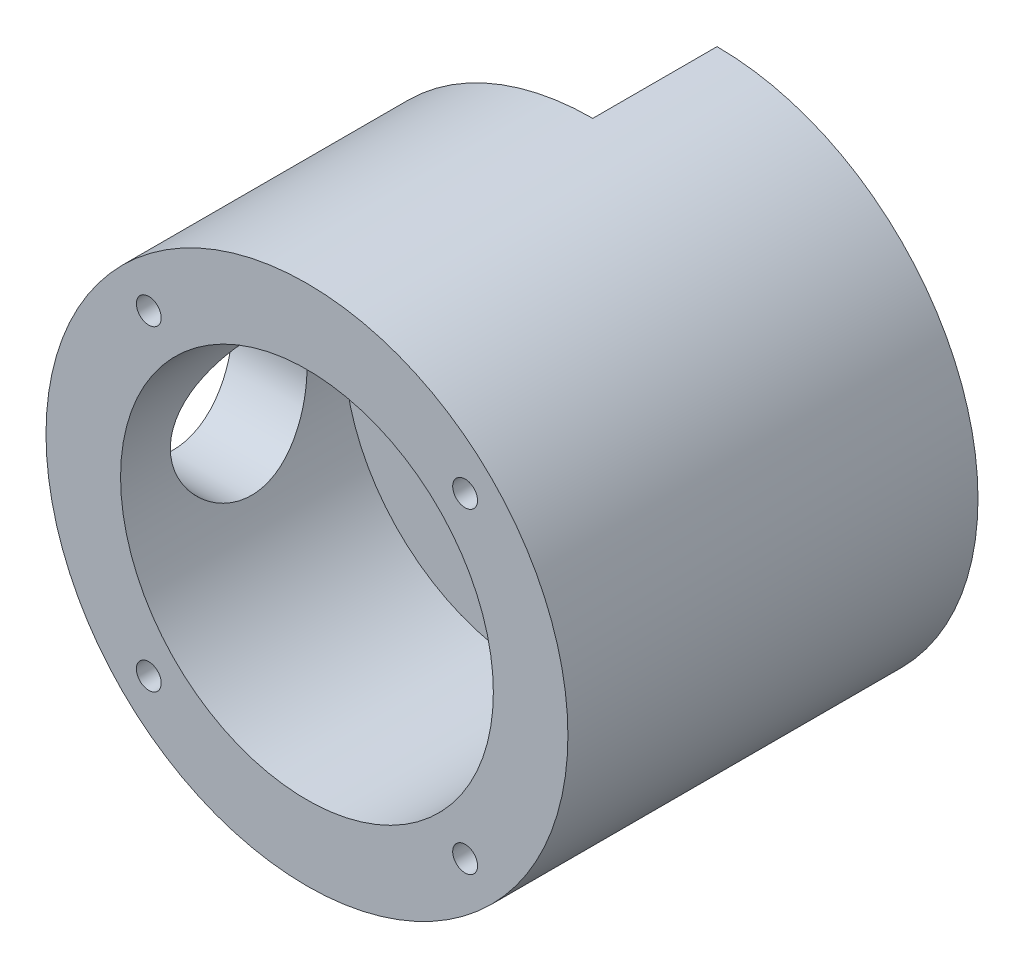
ISO-10303-21;
HEADER;
FILE_DESCRIPTION(('STEP AP214'),'2;1');
FILE_NAME('part.step','',(''),(''),'','','');
FILE_SCHEMA(('AUTOMOTIVE_DESIGN { 1 0 10303 214 1 1 1 1 }'));
ENDSEC;
DATA;
#1=APPLICATION_CONTEXT('core data for automotive mechanical design processes');
#2=APPLICATION_PROTOCOL_DEFINITION('international standard','automotive_design',2000,#1);
#3=PRODUCT_CONTEXT('',#1,'mechanical');
#4=PRODUCT('Part','Part','',(#3));
#5=PRODUCT_RELATED_PRODUCT_CATEGORY('part','',(#4));
#6=PRODUCT_DEFINITION_FORMATION('','',#4);
#7=PRODUCT_DEFINITION_CONTEXT('part definition',#1,'design');
#8=PRODUCT_DEFINITION('design','',#6,#7);
#9=PRODUCT_DEFINITION_SHAPE('','',#8);
#10=(LENGTH_UNIT() NAMED_UNIT(*) SI_UNIT(.MILLI.,.METRE.));
#11=(NAMED_UNIT(*) PLANE_ANGLE_UNIT() SI_UNIT($,.RADIAN.));
#12=(NAMED_UNIT(*) SI_UNIT($,.STERADIAN.) SOLID_ANGLE_UNIT());
#13=UNCERTAINTY_MEASURE_WITH_UNIT(LENGTH_MEASURE(1.E-05),#10,'distance_accuracy_value','');
#14=(GEOMETRIC_REPRESENTATION_CONTEXT(3) GLOBAL_UNCERTAINTY_ASSIGNED_CONTEXT((#13)) GLOBAL_UNIT_ASSIGNED_CONTEXT((#10,
#11,#12)) REPRESENTATION_CONTEXT('',''));
#15=CARTESIAN_POINT('',(0.,0.,0.));
#16=DIRECTION('',(0.,0.,1.));
#17=DIRECTION('',(1.,0.,0.));
#18=AXIS2_PLACEMENT_3D('',#15,#16,#17);
#19=CARTESIAN_POINT('',(0.,0.,16.5));
#20=DIRECTION('',(0.,0.,-1.));
#21=DIRECTION('',(-1.,0.,0.));
#22=AXIS2_PLACEMENT_3D('',#19,#20,#21);
#23=CYLINDRICAL_SURFACE('',#22,10.5);
#24=CARTESIAN_POINT('',(0.,0.,16.5));
#25=DIRECTION('',(0.,0.,1.));
#26=DIRECTION('',(1.,0.,0.));
#27=AXIS2_PLACEMENT_3D('',#24,#25,#26);
#28=CIRCLE('',#27,10.5);
#29=CARTESIAN_POINT('',(10.5,0.,16.5));
#30=VERTEX_POINT('',#29);
#31=EDGE_CURVE('E109',#30,#30,#28,.T.);
#32=ORIENTED_EDGE('',*,*,#31,.F.);
#33=EDGE_LOOP('',(#32));
#34=FACE_BOUND('',#33,.T.);
#35=CARTESIAN_POINT('',(-10.5,0.,9.));
#36=CARTESIAN_POINT('',(-10.4999976211832,0.151699030354285,9.00000380161948));
#37=CARTESIAN_POINT('',(-10.4966800161284,0.303439282198767,9.01259445179598));
#38=CARTESIAN_POINT('',(-10.4837674112809,0.602555081645901,9.06253926101277));
#39=CARTESIAN_POINT('',(-10.4741692343896,0.749928380714927,9.09990595342234));
#40=CARTESIAN_POINT('',(-10.4497558838716,1.03594889526858,9.19810958008399));
#41=CARTESIAN_POINT('',(-10.4349473049954,1.1746068813669,9.25891685509717));
#42=CARTESIAN_POINT('',(-10.4016816762864,1.43975589002758,9.40216722285691));
#43=CARTESIAN_POINT('',(-10.3832244178235,1.5662462162333,9.48461155288927));
#44=CARTESIAN_POINT('',(-10.3441944173703,1.80630697743584,9.67074874961714));
#45=CARTESIAN_POINT('',(-10.3235865293706,1.91956554687952,9.77483647100944));
#46=CARTESIAN_POINT('',(-10.282805840635,2.12723485642639,10.0004613265596));
#47=CARTESIAN_POINT('',(-10.2626330941127,2.22164325997989,10.1220006207003));
#48=CARTESIAN_POINT('',(-10.2246487400459,2.39043716747778,10.3815480933046));
#49=CARTESIAN_POINT('',(-10.2068815571234,2.46446679119027,10.5197948114292));
#50=CARTESIAN_POINT('',(-10.1762355329475,2.5881105434163,10.8073125815189));
#51=CARTESIAN_POINT('',(-10.1633558257529,2.63772899745505,10.9565816749846));
#52=CARTESIAN_POINT('',(-10.1443054302581,2.71006441497166,11.2584601860755));
#53=CARTESIAN_POINT('',(-10.1379943064967,2.73334545671158,11.4109253652931));
#54=CARTESIAN_POINT('',(-10.1323758380217,2.75410333127123,11.7177179296329));
#55=CARTESIAN_POINT('',(-10.1330672345731,2.75158480168089,11.8720449750947));
#56=CARTESIAN_POINT('',(-10.141249834272,2.72126349646028,12.1738011480325));
#57=CARTESIAN_POINT('',(-10.1485582884237,2.69414021293324,12.3213042923172));
#58=CARTESIAN_POINT('',(-10.1688593120466,2.61646635255774,12.6095898013828));
#59=CARTESIAN_POINT('',(-10.1818523214475,2.56591396250477,12.7503716450645));
#60=CARTESIAN_POINT('',(-10.2122212111083,2.44225583822384,13.0230042557005));
#61=CARTESIAN_POINT('',(-10.2296434789058,2.36890945220081,13.1547404850376));
#62=CARTESIAN_POINT('',(-10.2668825360075,2.20191337517857,13.4042754815964));
#63=CARTESIAN_POINT('',(-10.2866997812112,2.10825981587359,13.5220715867516));
#64=CARTESIAN_POINT('',(-10.3272591505417,1.89982032136867,13.7442682166731));
#65=CARTESIAN_POINT('',(-10.3480107723651,1.78446295417953,13.8481316860831));
#66=CARTESIAN_POINT('',(-10.3875415459927,1.53771555615344,14.0351467610954));
#67=CARTESIAN_POINT('',(-10.4063206253941,1.40632493719303,14.1182976065874));
#68=CARTESIAN_POINT('',(-10.4398992665687,1.13042817004538,14.261751984903));
#69=CARTESIAN_POINT('',(-10.4546823361005,0.985870863221988,14.3219612398386));
#70=CARTESIAN_POINT('',(-10.4784839163945,0.688211172875008,14.4170700963469));
#71=CARTESIAN_POINT('',(-10.487503640756,0.535110595713275,14.4519750265118));
#72=CARTESIAN_POINT('',(-10.4985798673941,0.2292960996151,14.4946479031064));
#73=CARTESIAN_POINT('',(-10.5008237661466,0.0766907493557651,14.5031463610687));
#74=CARTESIAN_POINT('',(-10.4986328208253,-0.227763755149755,14.4947784245054));
#75=CARTESIAN_POINT('',(-10.4941986408529,-0.379612983081902,14.4779145521362));
#76=CARTESIAN_POINT('',(-10.4792705379926,-0.675657576422796,14.4199007532301));
#77=CARTESIAN_POINT('',(-10.4688776931323,-0.819937840612927,14.379155677693));
#78=CARTESIAN_POINT('',(-10.4432088014506,-1.09960336766341,14.2750039580943));
#79=CARTESIAN_POINT('',(-10.4279322353376,-1.23498768276126,14.211594904062));
#80=CARTESIAN_POINT('',(-10.3937484592314,-1.49587662833364,14.0625425286576));
#81=CARTESIAN_POINT('',(-10.3747775851939,-1.62114370152729,13.9764983685683));
#82=CARTESIAN_POINT('',(-10.3353993918188,-1.85571833102839,13.7851246097984));
#83=CARTESIAN_POINT('',(-10.314991799635,-1.96502284371534,13.6797913418238));
#84=CARTESIAN_POINT('',(-10.2743550479459,-2.16762826163148,13.4494250193178));
#85=CARTESIAN_POINT('',(-10.2541457480291,-2.26041457148243,13.3239350608389));
#86=CARTESIAN_POINT('',(-10.2168050032952,-2.42361951747844,13.0587415866291));
#87=CARTESIAN_POINT('',(-10.1996734268538,-2.49403911027472,12.9190386791407));
#88=CARTESIAN_POINT('',(-10.170622883033,-2.60998166653511,12.6301008576905));
#89=CARTESIAN_POINT('',(-10.158673498307,-2.65565031429551,12.48092762472));
#90=CARTESIAN_POINT('',(-10.1413264323651,-2.72115196995047,12.1766548571598));
#91=CARTESIAN_POINT('',(-10.1359271486466,-2.74099129715573,12.0215567816832));
#92=CARTESIAN_POINT('',(-10.1324220951806,-2.75391719761804,11.7150958917912));
#93=CARTESIAN_POINT('',(-10.1340912086084,-2.74782946924648,11.5637699469166));
#94=CARTESIAN_POINT('',(-10.1440097395921,-2.71098193388369,11.2643832959387));
#95=CARTESIAN_POINT('',(-10.1522589990313,-2.68022271973234,11.1163225114636));
#96=CARTESIAN_POINT('',(-10.1742767855506,-2.59537614780223,10.8286669905732));
#97=CARTESIAN_POINT('',(-10.1880052532621,-2.54145789608221,10.6890190943468));
#98=CARTESIAN_POINT('',(-10.2194368711659,-2.41195566960282,10.4206474456871));
#99=CARTESIAN_POINT('',(-10.2371406242772,-2.33636840789159,10.291925354421));
#100=CARTESIAN_POINT('',(-10.275157455233,-2.16314628240861,10.0451036669708));
#101=CARTESIAN_POINT('',(-10.2955304541147,-2.06494517636386,9.92741063918568));
#102=CARTESIAN_POINT('',(-10.3362490598169,-1.8503675925024,9.70990558859248));
#103=CARTESIAN_POINT('',(-10.3565946588404,-1.73398673418866,9.6100978878161));
#104=CARTESIAN_POINT('',(-10.3954624251291,-1.48348626520137,9.42919845059151));
#105=CARTESIAN_POINT('',(-10.413938891974,-1.34905304383382,9.34853035968108));
#106=CARTESIAN_POINT('',(-10.4464921374026,-1.06805625594693,9.21106655237914));
#107=CARTESIAN_POINT('',(-10.4605718347814,-0.921500818857354,9.15425499015979));
#108=CARTESIAN_POINT('',(-10.4808477513834,-0.646170211360511,9.07382757314458));
#109=CARTESIAN_POINT('',(-10.4879783940631,-0.518619639204752,9.04620521175427));
#110=CARTESIAN_POINT('',(-10.4975553264723,-0.260722689528127,9.00929062943811));
#111=CARTESIAN_POINT('',(-10.5000020444558,-0.130376568708019,8.99999673272728));
#112=CARTESIAN_POINT('',(-10.5,0.,9.));
#113=B_SPLINE_CURVE_WITH_KNOTS('',3,(#35,#36,#37,#38,#39,#40,#41,#42,#43,#44,#45,#46,#47,#48,
#49,#50,#51,#52,#53,#54,#55,#56,#57,#58,#59,#60,#61,#62,#63,#64,#65,#66,#67,#68,#69,#70,#71,#72,
#73,#74,#75,#76,#77,#78,#79,#80,#81,#82,#83,#84,#85,#86,#87,#88,#89,#90,#91,#92,#93,#94,#95,#96,
#97,#98,#99,#100,#101,#102,#103,#104,#105,#106,#107,#108,#109,#110,#111,#112),.UNSPECIFIED.,.T.,
.F.,(4,2,2,2,2,2,2,2,2,2,2,2,2,2,2,2,2,2,2,2,2,2,2,2,2,2,2,2,2,2,2,2,2,2,2,2,2,2,4),(0.,
0.454619067375411,0.909468286935072,1.3637438673851,1.8180454306337,2.28150550262405,
2.74502298663621,3.21618449651077,3.68726248905687,4.14804800533863,4.60875069478824,
5.05710536682821,5.50549474332855,5.95878884109013,6.4121693626496,6.87979239640732,
7.34743258843057,7.81697432545315,8.28641715749482,8.74275209708794,9.19904165946454,
9.64781089463176,10.0966278638108,10.5540013012772,11.0114618337119,11.4813325478001,
11.9511831622489,12.4182373378545,12.8851772241423,13.3373595740061,13.7895310585453,
14.2384554900225,14.687448054492,15.1492187209845,15.6111008254151,16.0824114838811,
16.5534085943846,16.9441631953516,17.3348820676821),.UNSPECIFIED.);
#114=CARTESIAN_POINT('',(-10.5,0.,9.));
#115=VERTEX_POINT('',#114);
#116=EDGE_CURVE('E125',#115,#115,#113,.T.);
#117=ORIENTED_EDGE('',*,*,#116,.T.);
#118=EDGE_LOOP('',(#117));
#119=FACE_BOUND('',#118,.T.);
#120=DIRECTION('',(0.,0.,1.));
#121=VECTOR('',#120,1.);
#122=CARTESIAN_POINT('',(0.,10.5,0.));
#123=LINE('',#122,#121);
#124=CARTESIAN_POINT('',(0.,10.5,0.));
#125=VERTEX_POINT('',#124);
#126=CARTESIAN_POINT('',(0.,10.5,5.));
#127=VERTEX_POINT('',#126);
#128=EDGE_CURVE('E84',#125,#127,#123,.T.);
#129=ORIENTED_EDGE('',*,*,#128,.T.);
#130=CARTESIAN_POINT('',(0.,0.,5.));
#131=DIRECTION('',(0.,0.,1.));
#132=DIRECTION('',(0.,-1.,0.));
#133=AXIS2_PLACEMENT_3D('',#130,#131,#132);
#134=CIRCLE('',#133,10.5);
#135=CARTESIAN_POINT('',(0.,-10.5,5.));
#136=VERTEX_POINT('',#135);
#137=EDGE_CURVE('E126',#127,#136,#134,.T.);
#138=ORIENTED_EDGE('',*,*,#137,.T.);
#139=DIRECTION('',(0.,0.,-1.));
#140=VECTOR('',#139,1.);
#141=CARTESIAN_POINT('',(0.,-10.5,0.));
#142=LINE('',#141,#140);
#143=CARTESIAN_POINT('',(0.,-10.5,0.));
#144=VERTEX_POINT('',#143);
#145=EDGE_CURVE('E108',#136,#144,#142,.T.);
#146=ORIENTED_EDGE('',*,*,#145,.T.);
#147=CARTESIAN_POINT('',(0.,0.,0.));
#148=DIRECTION('',(0.,0.,1.));
#149=DIRECTION('',(1.,0.,0.));
#150=AXIS2_PLACEMENT_3D('',#147,#148,#149);
#151=CIRCLE('',#150,10.5);
#152=EDGE_CURVE('E101',#144,#125,#151,.T.);
#153=ORIENTED_EDGE('',*,*,#152,.T.);
#154=EDGE_LOOP('',(#129,#138,#146,#153));
#155=FACE_BOUND('',#154,.T.);
#156=ADVANCED_FACE('F33',(#34,#119,#155),#23,.T.);
#157=CARTESIAN_POINT('',(0.,0.,0.));
#158=DIRECTION('',(0.,0.,1.));
#159=DIRECTION('',(1.,0.,0.));
#160=AXIS2_PLACEMENT_3D('',#157,#158,#159);
#161=PLANE('',#160);
#162=DIRECTION('',(0.,1.,0.));
#163=VECTOR('',#162,1.);
#164=CARTESIAN_POINT('',(0.,10.5,0.));
#165=LINE('',#164,#163);
#166=CARTESIAN_POINT('',(0.,5.5,0.));
#167=VERTEX_POINT('',#166);
#168=EDGE_CURVE('E87',#167,#125,#165,.T.);
#169=ORIENTED_EDGE('',*,*,#168,.T.);
#170=ORIENTED_EDGE('',*,*,#152,.F.);
#171=CARTESIAN_POINT('',(0.,-5.5,0.));
#172=VERTEX_POINT('',#171);
#173=EDGE_CURVE('E94',#144,#172,#165,.T.);
#174=ORIENTED_EDGE('',*,*,#173,.T.);
#175=CARTESIAN_POINT('',(0.,0.,0.));
#176=DIRECTION('',(0.,0.,-1.));
#177=DIRECTION('',(-1.,0.,0.));
#178=AXIS2_PLACEMENT_3D('',#175,#176,#177);
#179=CIRCLE('',#178,5.5);
#180=EDGE_CURVE('E103',#167,#172,#179,.T.);
#181=ORIENTED_EDGE('',*,*,#180,.F.);
#182=EDGE_LOOP('',(#169,#170,#174,#181));
#183=FACE_BOUND('',#182,.T.);
#184=ADVANCED_FACE('F99',(#183),#161,.F.);
#185=CARTESIAN_POINT('',(0.,0.,0.));
#186=DIRECTION('',(0.,0.,-1.));
#187=DIRECTION('',(-1.,0.,0.));
#188=AXIS2_PLACEMENT_3D('',#185,#186,#187);
#189=CYLINDRICAL_SURFACE('',#188,7.5);
#190=DIRECTION('',(0.,0.,-1.));
#191=VECTOR('',#190,1.);
#192=CARTESIAN_POINT('',(0.,7.5,0.));
#193=LINE('',#192,#191);
#194=CARTESIAN_POINT('',(0.,7.5,2.5));
#195=VERTEX_POINT('',#194);
#196=CARTESIAN_POINT('',(0.,7.5,5.));
#197=VERTEX_POINT('',#196);
#198=EDGE_CURVE('E431',#195,#197,#193,.F.);
#199=ORIENTED_EDGE('',*,*,#198,.F.);
#200=CARTESIAN_POINT('',(0.,0.,2.5));
#201=DIRECTION('',(0.,0.,-1.));
#202=DIRECTION('',(-1.,0.,0.));
#203=AXIS2_PLACEMENT_3D('',#200,#201,#202);
#204=CIRCLE('',#203,7.5);
#205=CARTESIAN_POINT('',(0.,-7.5,2.5));
#206=VERTEX_POINT('',#205);
#207=EDGE_CURVE('E153',#195,#206,#204,.T.);
#208=ORIENTED_EDGE('',*,*,#207,.T.);
#209=DIRECTION('',(0.,0.,-1.));
#210=VECTOR('',#209,1.);
#211=CARTESIAN_POINT('',(0.,-7.5,0.));
#212=LINE('',#211,#210);
#213=CARTESIAN_POINT('',(0.,-7.5,5.));
#214=VERTEX_POINT('',#213);
#215=EDGE_CURVE('E430',#214,#206,#212,.T.);
#216=ORIENTED_EDGE('',*,*,#215,.F.);
#217=CARTESIAN_POINT('',(0.,0.,5.));
#218=DIRECTION('',(0.,0.,-1.));
#219=DIRECTION('',(-1.,0.,0.));
#220=AXIS2_PLACEMENT_3D('',#217,#218,#219);
#221=CIRCLE('',#220,7.5);
#222=EDGE_CURVE('E156',#197,#214,#221,.T.);
#223=ORIENTED_EDGE('',*,*,#222,.F.);
#224=EDGE_LOOP('',(#199,#208,#216,#223));
#225=FACE_BOUND('',#224,.T.);
#226=ADVANCED_FACE('F199',(#225),#189,.F.);
#227=CARTESIAN_POINT('',(0.,7.5,2.5));
#228=DIRECTION('',(0.,0.,-1.));
#229=DIRECTION('',(-1.,0.,0.));
#230=AXIS2_PLACEMENT_3D('',#227,#228,#229);
#231=PLANE('',#230);
#232=DIRECTION('',(0.,1.,0.));
#233=VECTOR('',#232,1.);
#234=CARTESIAN_POINT('',(0.,7.5,2.5));
#235=LINE('',#234,#233);
#236=CARTESIAN_POINT('',(0.,-5.5,2.5));
#237=VERTEX_POINT('',#236);
#238=EDGE_CURVE('E48',#206,#237,#235,.T.);
#239=ORIENTED_EDGE('',*,*,#238,.F.);
#240=ORIENTED_EDGE('',*,*,#207,.F.);
#241=CARTESIAN_POINT('',(0.,5.5,2.5));
#242=VERTEX_POINT('',#241);
#243=EDGE_CURVE('E55',#242,#195,#235,.T.);
#244=ORIENTED_EDGE('',*,*,#243,.F.);
#245=CARTESIAN_POINT('',(0.,0.,2.5));
#246=DIRECTION('',(0.,0.,-1.));
#247=DIRECTION('',(-1.,0.,0.));
#248=AXIS2_PLACEMENT_3D('',#245,#246,#247);
#249=CIRCLE('',#248,5.5);
#250=EDGE_CURVE('E150',#242,#237,#249,.T.);
#251=ORIENTED_EDGE('',*,*,#250,.T.);
#252=EDGE_LOOP('',(#239,#240,#244,#251));
#253=FACE_BOUND('',#252,.T.);
#254=ADVANCED_FACE('F203',(#253),#231,.F.);
#255=CARTESIAN_POINT('',(0.,0.,0.));
#256=DIRECTION('',(0.,0.,-1.));
#257=DIRECTION('',(-1.,0.,0.));
#258=AXIS2_PLACEMENT_3D('',#255,#256,#257);
#259=CYLINDRICAL_SURFACE('',#258,5.5);
#260=DIRECTION('',(0.,0.,-1.));
#261=VECTOR('',#260,1.);
#262=CARTESIAN_POINT('',(0.,5.5,0.));
#263=LINE('',#262,#261);
#264=EDGE_CURVE('E11',#167,#242,#263,.F.);
#265=ORIENTED_EDGE('',*,*,#264,.F.);
#266=ORIENTED_EDGE('',*,*,#180,.T.);
#267=DIRECTION('',(0.,0.,-1.));
#268=VECTOR('',#267,1.);
#269=CARTESIAN_POINT('',(0.,-5.5,0.));
#270=LINE('',#269,#268);
#271=EDGE_CURVE('E41',#237,#172,#270,.T.);
#272=ORIENTED_EDGE('',*,*,#271,.F.);
#273=ORIENTED_EDGE('',*,*,#250,.F.);
#274=EDGE_LOOP('',(#265,#266,#272,#273));
#275=FACE_BOUND('',#274,.T.);
#276=ADVANCED_FACE('F139',(#275),#259,.F.);
#277=CARTESIAN_POINT('',(0.,0.,16.5));
#278=DIRECTION('',(0.,0.,1.));
#279=DIRECTION('',(1.,0.,0.));
#280=AXIS2_PLACEMENT_3D('',#277,#278,#279);
#281=PLANE('',#280);
#282=CARTESIAN_POINT('',(6.36396103067892,-6.36396103067894,16.5));
#283=DIRECTION('',(0.,0.,1.));
#284=DIRECTION('',(0.,-1.,0.));
#285=AXIS2_PLACEMENT_3D('',#282,#283,#284);
#286=CIRCLE('',#285,0.5);
#287=CARTESIAN_POINT('',(6.36396103067891,-6.86396103067894,16.5));
#288=VERTEX_POINT('',#287);
#289=EDGE_CURVE('E164',#288,#288,#286,.T.);
#290=ORIENTED_EDGE('',*,*,#289,.F.);
#291=EDGE_LOOP('',(#290));
#292=FACE_BOUND('',#291,.T.);
#293=CARTESIAN_POINT('',(-6.36396103067891,-6.36396103067894,16.5));
#294=DIRECTION('',(0.,0.,1.));
#295=DIRECTION('',(-1.,0.,0.));
#296=AXIS2_PLACEMENT_3D('',#293,#294,#295);
#297=CIRCLE('',#296,0.5);
#298=CARTESIAN_POINT('',(-6.86396103067891,-6.36396103067894,16.5));
#299=VERTEX_POINT('',#298);
#300=EDGE_CURVE('E170',#299,#299,#297,.T.);
#301=ORIENTED_EDGE('',*,*,#300,.F.);
#302=EDGE_LOOP('',(#301));
#303=FACE_BOUND('',#302,.T.);
#304=CARTESIAN_POINT('',(-6.36396103067887,6.36396103067898,16.5));
#305=DIRECTION('',(0.,0.,1.));
#306=DIRECTION('',(0.,1.,0.));
#307=AXIS2_PLACEMENT_3D('',#304,#305,#306);
#308=CIRCLE('',#307,0.5);
#309=CARTESIAN_POINT('',(-6.36396103067887,6.86396103067898,16.5));
#310=VERTEX_POINT('',#309);
#311=EDGE_CURVE('E159',#310,#310,#308,.T.);
#312=ORIENTED_EDGE('',*,*,#311,.F.);
#313=EDGE_LOOP('',(#312));
#314=FACE_BOUND('',#313,.T.);
#315=CARTESIAN_POINT('',(6.36396103067891,6.36396103067894,16.5));
#316=DIRECTION('',(0.,0.,1.));
#317=DIRECTION('',(1.,0.,0.));
#318=AXIS2_PLACEMENT_3D('',#315,#316,#317);
#319=CIRCLE('',#318,0.5);
#320=CARTESIAN_POINT('',(6.86396103067891,6.36396103067894,16.5));
#321=VERTEX_POINT('',#320);
#322=EDGE_CURVE('E163',#321,#321,#319,.T.);
#323=ORIENTED_EDGE('',*,*,#322,.F.);
#324=EDGE_LOOP('',(#323));
#325=FACE_BOUND('',#324,.T.);
#326=CARTESIAN_POINT('',(0.,0.,16.5));
#327=DIRECTION('',(0.,0.,1.));
#328=DIRECTION('',(1.,0.,0.));
#329=AXIS2_PLACEMENT_3D('',#326,#327,#328);
#330=CIRCLE('',#329,7.5);
#331=CARTESIAN_POINT('',(7.5,0.,16.5));
#332=VERTEX_POINT('',#331);
#333=EDGE_CURVE('E115',#332,#332,#330,.T.);
#334=ORIENTED_EDGE('',*,*,#333,.F.);
#335=EDGE_LOOP('',(#334));
#336=FACE_BOUND('',#335,.T.);
#337=ORIENTED_EDGE('',*,*,#31,.T.);
#338=EDGE_LOOP('',(#337));
#339=FACE_BOUND('',#338,.T.);
#340=ADVANCED_FACE('F186',(#292,#303,#314,#325,#336,#339),#281,.T.);
#341=CARTESIAN_POINT('',(0.,0.,7.5));
#342=DIRECTION('',(0.,0.,1.));
#343=DIRECTION('',(1.,0.,0.));
#344=AXIS2_PLACEMENT_3D('',#341,#342,#343);
#345=CYLINDRICAL_SURFACE('',#344,7.5);
#346=CARTESIAN_POINT('',(-7.5,0.,9.));
#347=CARTESIAN_POINT('',(-7.50000312186943,-0.149163400914619,8.99999576015585));
#348=CARTESIAN_POINT('',(-7.49551083407196,-0.29829715261848,9.01217451428514));
#349=CARTESIAN_POINT('',(-7.47803771691331,-0.592120610638628,9.06038076394274));
#350=CARTESIAN_POINT('',(-7.46505769251259,-0.736810737017477,9.09640599792119));
#351=CARTESIAN_POINT('',(-7.43200599882739,-1.01746784637523,9.19086854595593));
#352=CARTESIAN_POINT('',(-7.41194764249896,-1.15345064275875,9.2492638038986));
#353=CARTESIAN_POINT('',(-7.36674725461798,-1.41368339201445,9.38659980262048));
#354=CARTESIAN_POINT('',(-7.34160392586796,-1.53793033913379,9.46554578745375));
#355=CARTESIAN_POINT('',(-7.28769120419502,-1.7762429222357,9.64511658714314));
#356=CARTESIAN_POINT('',(-7.25882233991119,-1.88976472910907,9.74643300699934));
#357=CARTESIAN_POINT('',(-7.20121334184221,-2.09863947514447,9.96640025404347));
#358=CARTESIAN_POINT('',(-7.17247324728629,-2.19398720232952,10.085056036644));
#359=CARTESIAN_POINT('',(-7.11723192199313,-2.36719005872892,10.3415596285549));
#360=CARTESIAN_POINT('',(-7.09084889561058,-2.44428985961203,10.4799454567554));
#361=CARTESIAN_POINT('',(-7.04484932142569,-2.5738807153727,10.7688406266334));
#362=CARTESIAN_POINT('',(-7.02523020673632,-2.626381108384,10.9193453424172));
#363=CARTESIAN_POINT('',(-6.99603990329749,-2.70315787768425,11.2219588814006));
#364=CARTESIAN_POINT('',(-6.98610194555094,-2.72846856766621,11.3737687440343));
#365=CARTESIAN_POINT('',(-6.97632326042149,-2.75338169967862,11.6797811892959));
#366=CARTESIAN_POINT('',(-6.97647859485257,-2.7529941686023,11.8339828152304));
#367=CARTESIAN_POINT('',(-6.98655161563675,-2.72731524634158,12.1310789225906));
#368=CARTESIAN_POINT('',(-6.99591416236741,-2.70343999386611,12.2741180714193));
#369=CARTESIAN_POINT('',(-7.02242705549906,-2.63379801380004,12.5539973045031));
#370=CARTESIAN_POINT('',(-7.03957852258203,-2.58802813592603,12.6908364935814));
#371=CARTESIAN_POINT('',(-7.08008337610026,-2.47508832183277,12.9573857915592));
#372=CARTESIAN_POINT('',(-7.10354498086313,-2.40754043957437,13.0869185940038));
#373=CARTESIAN_POINT('',(-7.15398860670264,-2.25322516181072,13.3332293506763));
#374=CARTESIAN_POINT('',(-7.18097180350954,-2.16645134069005,13.4500030210703));
#375=CARTESIAN_POINT('',(-7.23752687525343,-1.96960155284458,13.6753454837079));
#376=CARTESIAN_POINT('',(-7.26715387777086,-1.85838932735392,13.782910199767));
#377=CARTESIAN_POINT('',(-7.32416772152515,-1.61915779399269,13.9781537541427));
#378=CARTESIAN_POINT('',(-7.3515542477326,-1.49113612914646,14.0658297990106));
#379=CARTESIAN_POINT('',(-7.40150404263883,-1.21944943250202,14.219849921192));
#380=CARTESIAN_POINT('',(-7.42399328235867,-1.07558804380358,14.2858733353786));
#381=CARTESIAN_POINT('',(-7.46106828194135,-0.777771681936057,14.3924524315738));
#382=CARTESIAN_POINT('',(-7.47565739110895,-0.623821017253827,14.4330189073552));
#383=CARTESIAN_POINT('',(-7.49470661210037,-0.318657156904126,14.4856341007007));
#384=CARTESIAN_POINT('',(-7.49964681722227,-0.167706972782518,14.4990358318725));
#385=CARTESIAN_POINT('',(-7.50031608885126,0.134347967443713,14.5008630018728));
#386=CARTESIAN_POINT('',(-7.49604709187873,0.28545268437452,14.4892936916369));
#387=CARTESIAN_POINT('',(-7.47909471176213,0.577771015399045,14.4425452079771));
#388=CARTESIAN_POINT('',(-7.46672323625137,0.719144462031497,14.4082406720003));
#389=CARTESIAN_POINT('',(-7.43512235809386,0.994039091678321,14.3181349472647));
#390=CARTESIAN_POINT('',(-7.41589206317618,1.12755925041647,14.2623309615443));
#391=CARTESIAN_POINT('',(-7.3717934654489,1.38727106994184,14.1290539116285));
#392=CARTESIAN_POINT('',(-7.34677844528394,1.51313995048619,14.051001869951));
#393=CARTESIAN_POINT('',(-7.29389308718916,1.75040675458894,13.8761036082178));
#394=CARTESIAN_POINT('',(-7.26602173076095,1.86179948397539,13.7792506731475));
#395=CARTESIAN_POINT('',(-7.20858443222809,2.07340222713799,13.563177374235));
#396=CARTESIAN_POINT('',(-7.17901017230758,2.17265048905075,13.4430149402375));
#397=CARTESIAN_POINT('',(-7.12301420495134,2.34974917445373,13.1871450050785));
#398=CARTESIAN_POINT('',(-7.09659271654603,2.42759811177191,13.0514364251721));
#399=CARTESIAN_POINT('',(-7.05004267507774,2.55965637109161,12.7674626284658));
#400=CARTESIAN_POINT('',(-7.02993081583834,2.61380312956744,12.6191653988561));
#401=CARTESIAN_POINT('',(-6.99881623412452,2.69602324831299,12.314621151899));
#402=CARTESIAN_POINT('',(-6.98780821140261,2.72411178082589,12.1583788165147));
#403=CARTESIAN_POINT('',(-6.97683139543633,2.75209516962454,11.8527486399612));
#404=CARTESIAN_POINT('',(-6.97622414135252,2.75362072167425,11.7035317080346));
#405=CARTESIAN_POINT('',(-6.98449276936025,2.73257863119115,11.4070884497829));
#406=CARTESIAN_POINT('',(-6.99336783146823,2.710013071938,11.2598619524497));
#407=CARTESIAN_POINT('',(-7.01908063198066,2.64267697104267,10.975730914034));
#408=CARTESIAN_POINT('',(-7.03568945153917,2.59854310235921,10.8386530299248));
#409=CARTESIAN_POINT('',(-7.0748745278557,2.48987356543402,10.5737608470382));
#410=CARTESIAN_POINT('',(-7.09745226019147,2.42533285163216,10.445948848854));
#411=CARTESIAN_POINT('',(-7.14745651289183,2.2738785374216,10.196173516875));
#412=CARTESIAN_POINT('',(-7.17507087475862,2.18599626211841,10.0748355716804));
#413=CARTESIAN_POINT('',(-7.23136315938062,1.99188099952364,9.84810675551708));
#414=CARTESIAN_POINT('',(-7.26004141030264,1.88564231243218,9.7427208569003));
#415=CARTESIAN_POINT('',(-7.31698041886031,1.65137159946744,9.54544002029642));
#416=CARTESIAN_POINT('',(-7.34514593066589,1.52250654028015,9.45450259631471));
#417=CARTESIAN_POINT('',(-7.39633669940812,1.25034215145006,9.2956226545033));
#418=CARTESIAN_POINT('',(-7.41936193536523,1.10704276289836,9.22768023052494));
#419=CARTESIAN_POINT('',(-7.45811714803401,0.806234015924115,9.11583002337379));
#420=CARTESIAN_POINT('',(-7.4736521370045,0.648460466045057,9.07255977437051));
#421=CARTESIAN_POINT('',(-7.49458959004745,0.32711098218088,9.01465347812442));
#422=CARTESIAN_POINT('',(-7.4999965772887,0.163537671643998,9.0000046484207));
#423=CARTESIAN_POINT('',(-7.5,0.,9.));
#424=B_SPLINE_CURVE_WITH_KNOTS('',3,(#346,#347,#348,#349,#350,#351,#352,#353,#354,#355,#356,
#357,#358,#359,#360,#361,#362,#363,#364,#365,#366,#367,#368,#369,#370,#371,#372,#373,#374,#375,
#376,#377,#378,#379,#380,#381,#382,#383,#384,#385,#386,#387,#388,#389,#390,#391,#392,#393,#394,
#395,#396,#397,#398,#399,#400,#401,#402,#403,#404,#405,#406,#407,#408,#409,#410,#411,#412,#413,
#414,#415,#416,#417,#418,#419,#420,#421,#422,#423),.UNSPECIFIED.,.T.,.F.,(4,2,2,2,2,2,2,2,2,2,2,
2,2,2,2,2,2,2,2,2,2,2,2,2,2,2,2,2,2,2,2,2,2,2,2,2,2,2,4),(0.,0.446887269349348,
0.893732162923371,1.33974106914939,1.7858638979375,2.24842473965862,2.71111803601497,
3.19050672893151,3.6697132943022,4.12996375453753,4.5900346359978,5.0239670519462,
5.45796192255757,5.89993527296308,6.34205656133036,6.81248619551747,7.28298186270095,
7.76015995462979,8.23713558552159,8.68970480563612,9.14217886831116,9.57818454876607,
10.0142469703521,10.462896209775,10.9117059866708,11.385386450699,11.8590998032843,
12.3340561236824,12.80873572978,13.254164536792,13.6995548284528,14.13252653843,
14.5656053837986,15.020648736522,15.4758336382825,15.9541458857872,16.4324600854427,
16.9226310274791,17.4125830067758),.UNSPECIFIED.);
#425=CARTESIAN_POINT('',(-7.5,0.,9.));
#426=VERTEX_POINT('',#425);
#427=EDGE_CURVE('E119',#426,#426,#424,.T.);
#428=ORIENTED_EDGE('',*,*,#427,.T.);
#429=EDGE_LOOP('',(#428));
#430=FACE_BOUND('',#429,.T.);
#431=CARTESIAN_POINT('',(0.,0.,7.5));
#432=DIRECTION('',(0.,0.,1.));
#433=DIRECTION('',(1.,0.,0.));
#434=AXIS2_PLACEMENT_3D('',#431,#432,#433);
#435=CIRCLE('',#434,7.5);
#436=CARTESIAN_POINT('',(7.5,0.,7.5));
#437=VERTEX_POINT('',#436);
#438=EDGE_CURVE('E110',#437,#437,#435,.T.);
#439=ORIENTED_EDGE('',*,*,#438,.F.);
#440=EDGE_LOOP('',(#439));
#441=FACE_BOUND('',#440,.T.);
#442=ORIENTED_EDGE('',*,*,#333,.T.);
#443=EDGE_LOOP('',(#442));
#444=FACE_BOUND('',#443,.T.);
#445=ADVANCED_FACE('F127',(#430,#441,#444),#345,.F.);
#446=CARTESIAN_POINT('',(0.,0.,7.5));
#447=DIRECTION('',(0.,0.,1.));
#448=DIRECTION('',(1.,0.,0.));
#449=AXIS2_PLACEMENT_3D('',#446,#447,#448);
#450=PLANE('',#449);
#451=ORIENTED_EDGE('',*,*,#438,.T.);
#452=EDGE_LOOP('',(#451));
#453=FACE_BOUND('',#452,.T.);
#454=ADVANCED_FACE('F244',(#453),#450,.T.);
#455=CARTESIAN_POINT('',(6.36396103067891,6.36396103067894,13.5));
#456=DIRECTION('',(0.,0.,1.));
#457=DIRECTION('',(1.,0.,0.));
#458=AXIS2_PLACEMENT_3D('',#455,#456,#457);
#459=CYLINDRICAL_SURFACE('',#458,0.5);
#460=CARTESIAN_POINT('',(6.36396103067891,6.36396103067894,13.5));
#461=DIRECTION('',(0.,0.,1.));
#462=DIRECTION('',(1.,0.,0.));
#463=AXIS2_PLACEMENT_3D('',#460,#461,#462);
#464=CIRCLE('',#463,0.5);
#465=CARTESIAN_POINT('',(6.86396103067891,6.36396103067894,13.5));
#466=VERTEX_POINT('',#465);
#467=EDGE_CURVE('E178',#466,#466,#464,.T.);
#468=ORIENTED_EDGE('',*,*,#467,.F.);
#469=EDGE_LOOP('',(#468));
#470=FACE_BOUND('',#469,.T.);
#471=ORIENTED_EDGE('',*,*,#322,.T.);
#472=EDGE_LOOP('',(#471));
#473=FACE_BOUND('',#472,.T.);
#474=ADVANCED_FACE('F241',(#470,#473),#459,.F.);
#475=CARTESIAN_POINT('',(6.36396103067891,6.36396103067894,13.5));
#476=DIRECTION('',(0.,0.,1.));
#477=DIRECTION('',(1.,0.,0.));
#478=AXIS2_PLACEMENT_3D('',#475,#476,#477);
#479=PLANE('',#478);
#480=ORIENTED_EDGE('',*,*,#467,.T.);
#481=EDGE_LOOP('',(#480));
#482=FACE_BOUND('',#481,.T.);
#483=ADVANCED_FACE('F237',(#482),#479,.T.);
#484=CARTESIAN_POINT('',(-6.36396103067887,6.36396103067898,13.5));
#485=DIRECTION('',(0.,0.,1.));
#486=DIRECTION('',(1.,0.,0.));
#487=AXIS2_PLACEMENT_3D('',#484,#485,#486);
#488=CYLINDRICAL_SURFACE('',#487,0.5);
#489=CARTESIAN_POINT('',(-6.36396103067887,6.36396103067898,13.5));
#490=DIRECTION('',(0.,0.,1.));
#491=DIRECTION('',(0.,1.,0.));
#492=AXIS2_PLACEMENT_3D('',#489,#490,#491);
#493=CIRCLE('',#492,0.5);
#494=CARTESIAN_POINT('',(-6.36396103067887,6.86396103067898,13.5));
#495=VERTEX_POINT('',#494);
#496=EDGE_CURVE('E173',#495,#495,#493,.T.);
#497=ORIENTED_EDGE('',*,*,#496,.F.);
#498=EDGE_LOOP('',(#497));
#499=FACE_BOUND('',#498,.T.);
#500=ORIENTED_EDGE('',*,*,#311,.T.);
#501=EDGE_LOOP('',(#500));
#502=FACE_BOUND('',#501,.T.);
#503=ADVANCED_FACE('F233',(#499,#502),#488,.F.);
#504=CARTESIAN_POINT('',(-6.36396103067887,6.36396103067898,13.5));
#505=DIRECTION('',(0.,0.,1.));
#506=DIRECTION('',(0.,1.,0.));
#507=AXIS2_PLACEMENT_3D('',#504,#505,#506);
#508=PLANE('',#507);
#509=ORIENTED_EDGE('',*,*,#496,.T.);
#510=EDGE_LOOP('',(#509));
#511=FACE_BOUND('',#510,.T.);
#512=ADVANCED_FACE('F229',(#511),#508,.T.);
#513=CARTESIAN_POINT('',(-6.36396103067891,-6.36396103067894,13.5));
#514=DIRECTION('',(0.,0.,1.));
#515=DIRECTION('',(1.,0.,0.));
#516=AXIS2_PLACEMENT_3D('',#513,#514,#515);
#517=CYLINDRICAL_SURFACE('',#516,0.5);
#518=CARTESIAN_POINT('',(-6.36396103067891,-6.36396103067894,13.5));
#519=DIRECTION('',(0.,0.,1.));
#520=DIRECTION('',(-1.,0.,0.));
#521=AXIS2_PLACEMENT_3D('',#518,#519,#520);
#522=CIRCLE('',#521,0.5);
#523=CARTESIAN_POINT('',(-6.86396103067891,-6.36396103067894,13.5));
#524=VERTEX_POINT('',#523);
#525=EDGE_CURVE('E167',#524,#524,#522,.T.);
#526=ORIENTED_EDGE('',*,*,#525,.F.);
#527=EDGE_LOOP('',(#526));
#528=FACE_BOUND('',#527,.T.);
#529=ORIENTED_EDGE('',*,*,#300,.T.);
#530=EDGE_LOOP('',(#529));
#531=FACE_BOUND('',#530,.T.);
#532=ADVANCED_FACE('F225',(#528,#531),#517,.F.);
#533=CARTESIAN_POINT('',(-6.36396103067891,-6.36396103067894,13.5));
#534=DIRECTION('',(0.,0.,1.));
#535=DIRECTION('',(-1.,0.,0.));
#536=AXIS2_PLACEMENT_3D('',#533,#534,#535);
#537=PLANE('',#536);
#538=ORIENTED_EDGE('',*,*,#525,.T.);
#539=EDGE_LOOP('',(#538));
#540=FACE_BOUND('',#539,.T.);
#541=ADVANCED_FACE('F221',(#540),#537,.T.);
#542=CARTESIAN_POINT('',(6.36396103067892,-6.36396103067894,13.5));
#543=DIRECTION('',(0.,0.,1.));
#544=DIRECTION('',(1.,0.,0.));
#545=AXIS2_PLACEMENT_3D('',#542,#543,#544);
#546=CYLINDRICAL_SURFACE('',#545,0.5);
#547=CARTESIAN_POINT('',(6.36396103067892,-6.36396103067894,13.5));
#548=DIRECTION('',(0.,0.,1.));
#549=DIRECTION('',(0.,-1.,0.));
#550=AXIS2_PLACEMENT_3D('',#547,#548,#549);
#551=CIRCLE('',#550,0.5);
#552=CARTESIAN_POINT('',(6.36396103067891,-6.86396103067894,13.5));
#553=VERTEX_POINT('',#552);
#554=EDGE_CURVE('E160',#553,#553,#551,.T.);
#555=ORIENTED_EDGE('',*,*,#554,.F.);
#556=EDGE_LOOP('',(#555));
#557=FACE_BOUND('',#556,.T.);
#558=ORIENTED_EDGE('',*,*,#289,.T.);
#559=EDGE_LOOP('',(#558));
#560=FACE_BOUND('',#559,.T.);
#561=ADVANCED_FACE('F217',(#557,#560),#546,.F.);
#562=CARTESIAN_POINT('',(6.36396103067892,-6.36396103067894,13.5));
#563=DIRECTION('',(0.,0.,1.));
#564=DIRECTION('',(0.,-1.,0.));
#565=AXIS2_PLACEMENT_3D('',#562,#563,#564);
#566=PLANE('',#565);
#567=ORIENTED_EDGE('',*,*,#554,.T.);
#568=EDGE_LOOP('',(#567));
#569=FACE_BOUND('',#568,.T.);
#570=ADVANCED_FACE('F213',(#569),#566,.T.);
#571=CARTESIAN_POINT('',(0.,0.,5.));
#572=DIRECTION('',(0.,0.,1.));
#573=DIRECTION('',(1.,0.,0.));
#574=AXIS2_PLACEMENT_3D('',#571,#572,#573);
#575=PLANE('',#574);
#576=DIRECTION('',(0.,-1.,0.));
#577=VECTOR('',#576,1.);
#578=CARTESIAN_POINT('',(0.,10.5,5.));
#579=LINE('',#578,#577);
#580=EDGE_CURVE('E90',#127,#197,#579,.T.);
#581=ORIENTED_EDGE('',*,*,#580,.T.);
#582=ORIENTED_EDGE('',*,*,#222,.T.);
#583=EDGE_CURVE('E93',#214,#136,#579,.T.);
#584=ORIENTED_EDGE('',*,*,#583,.T.);
#585=ORIENTED_EDGE('',*,*,#137,.F.);
#586=EDGE_LOOP('',(#581,#582,#584,#585));
#587=FACE_BOUND('',#586,.T.);
#588=ADVANCED_FACE('F136',(#587),#575,.F.);
#589=CARTESIAN_POINT('',(-10.5,0.,11.75));
#590=DIRECTION('',(1.,0.,0.));
#591=DIRECTION('',(0.,0.,-1.));
#592=AXIS2_PLACEMENT_3D('',#589,#590,#591);
#593=CYLINDRICAL_SURFACE('',#592,2.75);
#594=ORIENTED_EDGE('',*,*,#427,.F.);
#595=EDGE_LOOP('',(#594));
#596=FACE_BOUND('',#595,.T.);
#597=ORIENTED_EDGE('',*,*,#116,.F.);
#598=EDGE_LOOP('',(#597));
#599=FACE_BOUND('',#598,.T.);
#600=ADVANCED_FACE('F131',(#596,#599),#593,.F.);
#601=CARTESIAN_POINT('',(0.,0.,0.));
#602=DIRECTION('',(-1.,0.,0.));
#603=DIRECTION('',(0.,0.,1.));
#604=AXIS2_PLACEMENT_3D('',#601,#602,#603);
#605=PLANE('',#604);
#606=CARTESIAN_POINT('',(0.,9.,2.5));
#607=DIRECTION('',(-1.,0.,0.));
#608=DIRECTION('',(0.,0.,1.));
#609=AXIS2_PLACEMENT_3D('',#606,#607,#608);
#610=CIRCLE('',#609,0.5);
#611=CARTESIAN_POINT('',(0.,9.,3.));
#612=VERTEX_POINT('',#611);
#613=EDGE_CURVE('E417',#612,#612,#610,.T.);
#614=ORIENTED_EDGE('',*,*,#613,.F.);
#615=EDGE_LOOP('',(#614));
#616=FACE_BOUND('',#615,.T.);
#617=ORIENTED_EDGE('',*,*,#198,.T.);
#618=ORIENTED_EDGE('',*,*,#580,.F.);
#619=ORIENTED_EDGE('',*,*,#128,.F.);
#620=ORIENTED_EDGE('',*,*,#168,.F.);
#621=ORIENTED_EDGE('',*,*,#264,.T.);
#622=ORIENTED_EDGE('',*,*,#243,.T.);
#623=EDGE_LOOP('',(#617,#618,#619,#620,#621,#622));
#624=FACE_BOUND('',#623,.T.);
#625=ADVANCED_FACE('F86',(#616,#624),#605,.T.);
#626=CARTESIAN_POINT('',(0.,-9.,2.5));
#627=DIRECTION('',(1.,0.,0.));
#628=DIRECTION('',(0.,0.,1.));
#629=AXIS2_PLACEMENT_3D('',#626,#627,#628);
#630=CIRCLE('',#629,0.5);
#631=CARTESIAN_POINT('',(0.,-9.,3.));
#632=VERTEX_POINT('',#631);
#633=EDGE_CURVE('E418',#632,#632,#630,.T.);
#634=ORIENTED_EDGE('',*,*,#633,.T.);
#635=EDGE_LOOP('',(#634));
#636=FACE_BOUND('',#635,.T.);
#637=ORIENTED_EDGE('',*,*,#215,.T.);
#638=ORIENTED_EDGE('',*,*,#238,.T.);
#639=ORIENTED_EDGE('',*,*,#271,.T.);
#640=ORIENTED_EDGE('',*,*,#173,.F.);
#641=ORIENTED_EDGE('',*,*,#145,.F.);
#642=ORIENTED_EDGE('',*,*,#583,.F.);
#643=EDGE_LOOP('',(#637,#638,#639,#640,#641,#642));
#644=FACE_BOUND('',#643,.T.);
#645=ADVANCED_FACE('F304',(#636,#644),#605,.T.);
#646=CARTESIAN_POINT('',(2.,9.,2.5));
#647=DIRECTION('',(-1.,0.,0.));
#648=DIRECTION('',(0.,0.,1.));
#649=AXIS2_PLACEMENT_3D('',#646,#647,#648);
#650=CYLINDRICAL_SURFACE('',#649,0.5);
#651=CARTESIAN_POINT('',(2.,9.,2.5));
#652=DIRECTION('',(-1.,0.,0.));
#653=DIRECTION('',(0.,0.,1.));
#654=AXIS2_PLACEMENT_3D('',#651,#652,#653);
#655=CIRCLE('',#654,0.5);
#656=CARTESIAN_POINT('',(2.,9.,3.));
#657=VERTEX_POINT('',#656);
#658=EDGE_CURVE('E104',#657,#657,#655,.T.);
#659=ORIENTED_EDGE('',*,*,#658,.F.);
#660=EDGE_LOOP('',(#659));
#661=FACE_BOUND('',#660,.T.);
#662=ORIENTED_EDGE('',*,*,#613,.T.);
#663=EDGE_LOOP('',(#662));
#664=FACE_BOUND('',#663,.T.);
#665=ADVANCED_FACE('F312',(#661,#664),#650,.F.);
#666=CARTESIAN_POINT('',(2.,9.,2.5));
#667=DIRECTION('',(-1.,0.,0.));
#668=DIRECTION('',(0.,0.,1.));
#669=AXIS2_PLACEMENT_3D('',#666,#667,#668);
#670=PLANE('',#669);
#671=ORIENTED_EDGE('',*,*,#658,.T.);
#672=EDGE_LOOP('',(#671));
#673=FACE_BOUND('',#672,.T.);
#674=ADVANCED_FACE('F320',(#673),#670,.T.);
#675=CARTESIAN_POINT('',(2.,-9.,2.5));
#676=DIRECTION('',(-1.,0.,0.));
#677=DIRECTION('',(0.,0.,1.));
#678=AXIS2_PLACEMENT_3D('',#675,#676,#677);
#679=CYLINDRICAL_SURFACE('',#678,0.5);
#680=CARTESIAN_POINT('',(2.,-9.,2.5));
#681=DIRECTION('',(1.,0.,0.));
#682=DIRECTION('',(0.,0.,1.));
#683=AXIS2_PLACEMENT_3D('',#680,#681,#682);
#684=CIRCLE('',#683,0.5);
#685=CARTESIAN_POINT('',(2.,-9.,3.));
#686=VERTEX_POINT('',#685);
#687=EDGE_CURVE('E416',#686,#686,#684,.T.);
#688=ORIENTED_EDGE('',*,*,#687,.T.);
#689=EDGE_LOOP('',(#688));
#690=FACE_BOUND('',#689,.T.);
#691=ORIENTED_EDGE('',*,*,#633,.F.);
#692=EDGE_LOOP('',(#691));
#693=FACE_BOUND('',#692,.T.);
#694=ADVANCED_FACE('F326',(#690,#693),#679,.F.);
#695=CARTESIAN_POINT('',(2.,-9.,2.5));
#696=DIRECTION('',(-1.,0.,0.));
#697=DIRECTION('',(0.,0.,1.));
#698=AXIS2_PLACEMENT_3D('',#695,#696,#697);
#699=PLANE('',#698);
#700=ORIENTED_EDGE('',*,*,#687,.F.);
#701=EDGE_LOOP('',(#700));
#702=FACE_BOUND('',#701,.T.);
#703=ADVANCED_FACE('F333',(#702),#699,.T.);
#704=CLOSED_SHELL('',(#156,#184,#226,#254,#276,#340,#445,#454,#474,#483,#503,#512,#532,#541,
#561,#570,#588,#600,#625,#645,#665,#674,#694,#703));
#705=MANIFOLD_SOLID_BREP('B2',#704);
#706=ADVANCED_BREP_SHAPE_REPRESENTATION('',(#18,#705),#14);
#707=SHAPE_DEFINITION_REPRESENTATION(#9,#706);
ENDSEC;
END-ISO-10303-21;
